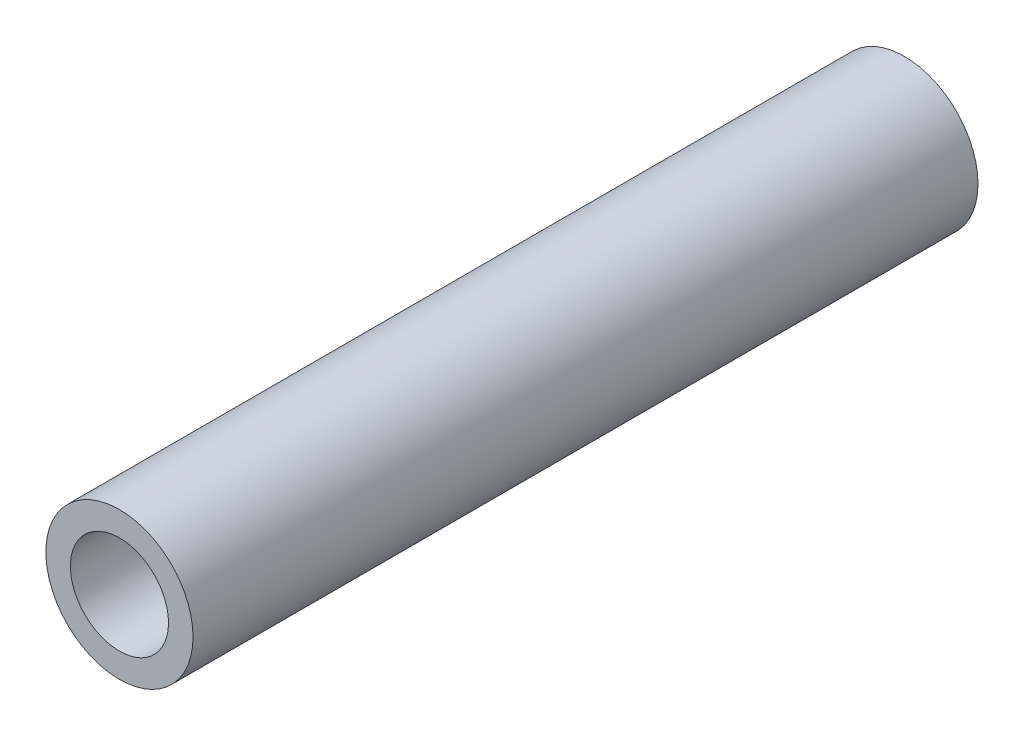
ISO-10303-21;
HEADER;
FILE_DESCRIPTION(('STEP AP214'),'2;1');
FILE_NAME('part.step','',(''),(''),'','','');
FILE_SCHEMA(('AUTOMOTIVE_DESIGN { 1 0 10303 214 1 1 1 1 }'));
ENDSEC;
DATA;
#1=APPLICATION_CONTEXT('core data for automotive mechanical design processes');
#2=APPLICATION_PROTOCOL_DEFINITION('international standard','automotive_design',2000,#1);
#3=PRODUCT_CONTEXT('',#1,'mechanical');
#4=PRODUCT('Part','Part','',(#3));
#5=PRODUCT_RELATED_PRODUCT_CATEGORY('part','',(#4));
#6=PRODUCT_DEFINITION_FORMATION('','',#4);
#7=PRODUCT_DEFINITION_CONTEXT('part definition',#1,'design');
#8=PRODUCT_DEFINITION('design','',#6,#7);
#9=PRODUCT_DEFINITION_SHAPE('','',#8);
#10=(LENGTH_UNIT() NAMED_UNIT(*) SI_UNIT(.MILLI.,.METRE.));
#11=(NAMED_UNIT(*) PLANE_ANGLE_UNIT() SI_UNIT($,.RADIAN.));
#12=(NAMED_UNIT(*) SI_UNIT($,.STERADIAN.) SOLID_ANGLE_UNIT());
#13=UNCERTAINTY_MEASURE_WITH_UNIT(LENGTH_MEASURE(1.E-05),#10,'distance_accuracy_value','');
#14=(GEOMETRIC_REPRESENTATION_CONTEXT(3) GLOBAL_UNCERTAINTY_ASSIGNED_CONTEXT((#13)) GLOBAL_UNIT_ASSIGNED_CONTEXT((#10,
#11,#12)) REPRESENTATION_CONTEXT('',''));
#15=CARTESIAN_POINT('',(0.,0.,0.));
#16=DIRECTION('',(0.,0.,1.));
#17=DIRECTION('',(1.,0.,0.));
#18=AXIS2_PLACEMENT_3D('',#15,#16,#17);
#19=CARTESIAN_POINT('',(0.,0.,16.));
#20=DIRECTION('',(0.,0.,-1.));
#21=DIRECTION('',(-1.,0.,0.));
#22=AXIS2_PLACEMENT_3D('',#19,#20,#21);
#23=CYLINDRICAL_SURFACE('',#22,1.5);
#24=CARTESIAN_POINT('',(0.,0.,16.));
#25=DIRECTION('',(0.,0.,1.));
#26=DIRECTION('',(1.,0.,0.));
#27=AXIS2_PLACEMENT_3D('',#24,#25,#26);
#28=CIRCLE('',#27,1.5);
#29=CARTESIAN_POINT('',(1.5,0.,16.));
#30=VERTEX_POINT('',#29);
#31=EDGE_CURVE('E10',#30,#30,#28,.T.);
#32=ORIENTED_EDGE('',*,*,#31,.F.);
#33=EDGE_LOOP('',(#32));
#34=FACE_BOUND('',#33,.T.);
#35=CARTESIAN_POINT('',(0.,0.,0.));
#36=DIRECTION('',(0.,0.,1.));
#37=DIRECTION('',(1.,0.,0.));
#38=AXIS2_PLACEMENT_3D('',#35,#36,#37);
#39=CIRCLE('',#38,1.5);
#40=CARTESIAN_POINT('',(1.5,0.,0.));
#41=VERTEX_POINT('',#40);
#42=EDGE_CURVE('E37',#41,#41,#39,.T.);
#43=ORIENTED_EDGE('',*,*,#42,.T.);
#44=EDGE_LOOP('',(#43));
#45=FACE_BOUND('',#44,.T.);
#46=ADVANCED_FACE('F34',(#34,#45),#23,.T.);
#47=CARTESIAN_POINT('',(0.,0.,16.));
#48=DIRECTION('',(0.,0.,1.));
#49=DIRECTION('',(1.,0.,0.));
#50=AXIS2_PLACEMENT_3D('',#47,#48,#49);
#51=PLANE('',#50);
#52=CARTESIAN_POINT('',(0.,0.,16.));
#53=DIRECTION('',(0.,0.,1.));
#54=DIRECTION('',(1.,0.,0.));
#55=AXIS2_PLACEMENT_3D('',#52,#53,#54);
#56=CIRCLE('',#55,1.);
#57=CARTESIAN_POINT('',(1.,0.,16.));
#58=VERTEX_POINT('',#57);
#59=EDGE_CURVE('E46',#58,#58,#56,.T.);
#60=ORIENTED_EDGE('',*,*,#59,.F.);
#61=EDGE_LOOP('',(#60));
#62=FACE_BOUND('',#61,.T.);
#63=ORIENTED_EDGE('',*,*,#31,.T.);
#64=EDGE_LOOP('',(#63));
#65=FACE_BOUND('',#64,.T.);
#66=ADVANCED_FACE('F61',(#62,#65),#51,.T.);
#67=CARTESIAN_POINT('',(0.,0.,0.));
#68=DIRECTION('',(0.,0.,1.));
#69=DIRECTION('',(1.,0.,0.));
#70=AXIS2_PLACEMENT_3D('',#67,#68,#69);
#71=PLANE('',#70);
#72=CARTESIAN_POINT('',(0.,0.,0.));
#73=DIRECTION('',(0.,0.,1.));
#74=DIRECTION('',(1.,0.,0.));
#75=AXIS2_PLACEMENT_3D('',#72,#73,#74);
#76=CIRCLE('',#75,1.);
#77=CARTESIAN_POINT('',(1.,0.,0.));
#78=VERTEX_POINT('',#77);
#79=EDGE_CURVE('E44',#78,#78,#76,.T.);
#80=ORIENTED_EDGE('',*,*,#79,.T.);
#81=EDGE_LOOP('',(#80));
#82=FACE_BOUND('',#81,.T.);
#83=ORIENTED_EDGE('',*,*,#42,.F.);
#84=EDGE_LOOP('',(#83));
#85=FACE_BOUND('',#84,.T.);
#86=ADVANCED_FACE('F52',(#82,#85),#71,.F.);
#87=CARTESIAN_POINT('',(0.,0.,0.));
#88=DIRECTION('',(0.,0.,1.));
#89=DIRECTION('',(1.,0.,0.));
#90=AXIS2_PLACEMENT_3D('',#87,#88,#89);
#91=CYLINDRICAL_SURFACE('',#90,1.);
#92=ORIENTED_EDGE('',*,*,#79,.F.);
#93=EDGE_LOOP('',(#92));
#94=FACE_BOUND('',#93,.T.);
#95=ORIENTED_EDGE('',*,*,#59,.T.);
#96=EDGE_LOOP('',(#95));
#97=FACE_BOUND('',#96,.T.);
#98=ADVANCED_FACE('F55',(#94,#97),#91,.F.);
#99=CLOSED_SHELL('',(#46,#66,#86,#98));
#100=MANIFOLD_SOLID_BREP('B2',#99);
#101=ADVANCED_BREP_SHAPE_REPRESENTATION('',(#18,#100),#14);
#102=SHAPE_DEFINITION_REPRESENTATION(#9,#101);
ENDSEC;
END-ISO-10303-21;
